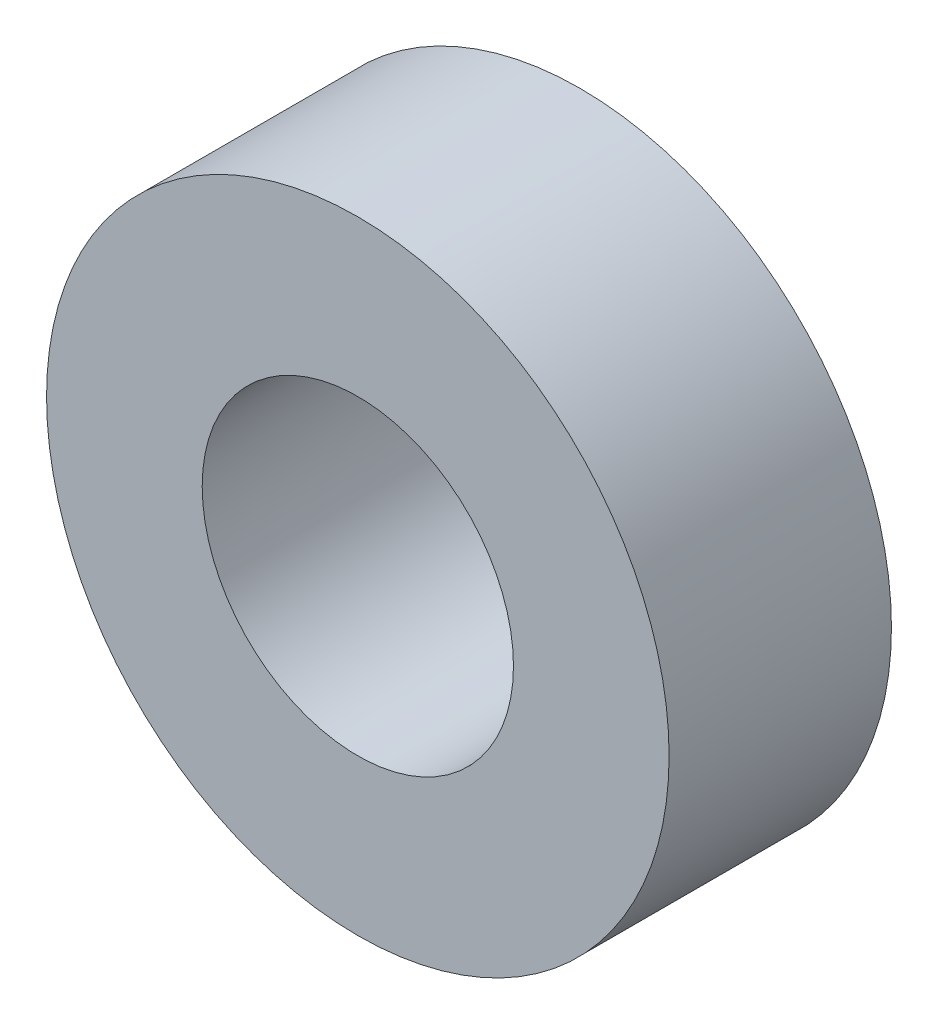
ISO-10303-21;
HEADER;
FILE_DESCRIPTION(('STEP AP214'),'2;1');
FILE_NAME('part.step','',(''),(''),'','','');
FILE_SCHEMA(('AUTOMOTIVE_DESIGN { 1 0 10303 214 1 1 1 1 }'));
ENDSEC;
DATA;
#1=APPLICATION_CONTEXT('core data for automotive mechanical design processes');
#2=APPLICATION_PROTOCOL_DEFINITION('international standard','automotive_design',2000,#1);
#3=PRODUCT_CONTEXT('',#1,'mechanical');
#4=PRODUCT('Part','Part','',(#3));
#5=PRODUCT_RELATED_PRODUCT_CATEGORY('part','',(#4));
#6=PRODUCT_DEFINITION_FORMATION('','',#4);
#7=PRODUCT_DEFINITION_CONTEXT('part definition',#1,'design');
#8=PRODUCT_DEFINITION('design','',#6,#7);
#9=PRODUCT_DEFINITION_SHAPE('','',#8);
#10=(LENGTH_UNIT() NAMED_UNIT(*) SI_UNIT(.MILLI.,.METRE.));
#11=(NAMED_UNIT(*) PLANE_ANGLE_UNIT() SI_UNIT($,.RADIAN.));
#12=(NAMED_UNIT(*) SI_UNIT($,.STERADIAN.) SOLID_ANGLE_UNIT());
#13=UNCERTAINTY_MEASURE_WITH_UNIT(LENGTH_MEASURE(1.E-05),#10,'distance_accuracy_value','');
#14=(GEOMETRIC_REPRESENTATION_CONTEXT(3) GLOBAL_UNCERTAINTY_ASSIGNED_CONTEXT((#13)) GLOBAL_UNIT_ASSIGNED_CONTEXT((#10,
#11,#12)) REPRESENTATION_CONTEXT('',''));
#15=CARTESIAN_POINT('',(0.,0.,0.));
#16=DIRECTION('',(0.,0.,1.));
#17=DIRECTION('',(1.,0.,0.));
#18=AXIS2_PLACEMENT_3D('',#15,#16,#17);
#19=CARTESIAN_POINT('',(0.,0.,5.));
#20=DIRECTION('',(0.,0.,1.));
#21=DIRECTION('',(1.,0.,0.));
#22=AXIS2_PLACEMENT_3D('',#19,#20,#21);
#23=PLANE('',#22);
#24=CARTESIAN_POINT('',(0.,0.,5.));
#25=DIRECTION('',(0.,0.,1.));
#26=DIRECTION('',(1.,0.,0.));
#27=AXIS2_PLACEMENT_3D('',#24,#25,#26);
#28=CIRCLE('',#27,7.);
#29=CARTESIAN_POINT('',(7.,0.,5.));
#30=VERTEX_POINT('',#29);
#31=EDGE_CURVE('E10',#30,#30,#28,.T.);
#32=ORIENTED_EDGE('',*,*,#31,.T.);
#33=EDGE_LOOP('',(#32));
#34=FACE_BOUND('',#33,.T.);
#35=CARTESIAN_POINT('',(0.,0.,5.));
#36=DIRECTION('',(0.,0.,1.));
#37=DIRECTION('',(1.,0.,0.));
#38=AXIS2_PLACEMENT_3D('',#35,#36,#37);
#39=CIRCLE('',#38,3.5);
#40=CARTESIAN_POINT('',(3.5,0.,5.));
#41=VERTEX_POINT('',#40);
#42=EDGE_CURVE('E52',#41,#41,#39,.T.);
#43=ORIENTED_EDGE('',*,*,#42,.F.);
#44=EDGE_LOOP('',(#43));
#45=FACE_BOUND('',#44,.T.);
#46=ADVANCED_FACE('F41',(#34,#45),#23,.T.);
#47=CARTESIAN_POINT('',(0.,0.,0.));
#48=DIRECTION('',(0.,0.,1.));
#49=DIRECTION('',(1.,0.,0.));
#50=AXIS2_PLACEMENT_3D('',#47,#48,#49);
#51=PLANE('',#50);
#52=CARTESIAN_POINT('',(0.,0.,0.));
#53=DIRECTION('',(0.,0.,1.));
#54=DIRECTION('',(1.,0.,0.));
#55=AXIS2_PLACEMENT_3D('',#52,#53,#54);
#56=CIRCLE('',#55,7.);
#57=CARTESIAN_POINT('',(7.,0.,0.));
#58=VERTEX_POINT('',#57);
#59=EDGE_CURVE('E45',#58,#58,#56,.T.);
#60=ORIENTED_EDGE('',*,*,#59,.F.);
#61=EDGE_LOOP('',(#60));
#62=FACE_BOUND('',#61,.T.);
#63=CARTESIAN_POINT('',(0.,0.,0.));
#64=DIRECTION('',(0.,0.,1.));
#65=DIRECTION('',(1.,0.,0.));
#66=AXIS2_PLACEMENT_3D('',#63,#64,#65);
#67=CIRCLE('',#66,3.5);
#68=CARTESIAN_POINT('',(3.5,0.,0.));
#69=VERTEX_POINT('',#68);
#70=EDGE_CURVE('E54',#69,#69,#67,.T.);
#71=ORIENTED_EDGE('',*,*,#70,.T.);
#72=EDGE_LOOP('',(#71));
#73=FACE_BOUND('',#72,.T.);
#74=ADVANCED_FACE('F64',(#62,#73),#51,.F.);
#75=CARTESIAN_POINT('',(0.,0.,5.));
#76=DIRECTION('',(0.,0.,-1.));
#77=DIRECTION('',(-1.,0.,0.));
#78=AXIS2_PLACEMENT_3D('',#75,#76,#77);
#79=CYLINDRICAL_SURFACE('',#78,7.);
#80=ORIENTED_EDGE('',*,*,#31,.F.);
#81=EDGE_LOOP('',(#80));
#82=FACE_BOUND('',#81,.T.);
#83=ORIENTED_EDGE('',*,*,#59,.T.);
#84=EDGE_LOOP('',(#83));
#85=FACE_BOUND('',#84,.T.);
#86=ADVANCED_FACE('F43',(#82,#85),#79,.T.);
#87=CARTESIAN_POINT('',(0.,0.,5.));
#88=DIRECTION('',(0.,0.,-1.));
#89=DIRECTION('',(-1.,0.,0.));
#90=AXIS2_PLACEMENT_3D('',#87,#88,#89);
#91=CYLINDRICAL_SURFACE('',#90,3.5);
#92=ORIENTED_EDGE('',*,*,#42,.T.);
#93=EDGE_LOOP('',(#92));
#94=FACE_BOUND('',#93,.T.);
#95=ORIENTED_EDGE('',*,*,#70,.F.);
#96=EDGE_LOOP('',(#95));
#97=FACE_BOUND('',#96,.T.);
#98=ADVANCED_FACE('F60',(#94,#97),#91,.F.);
#99=CLOSED_SHELL('',(#46,#74,#86,#98));
#100=MANIFOLD_SOLID_BREP('B2',#99);
#101=ADVANCED_BREP_SHAPE_REPRESENTATION('',(#18,#100),#14);
#102=SHAPE_DEFINITION_REPRESENTATION(#9,#101);
ENDSEC;
END-ISO-10303-21;
